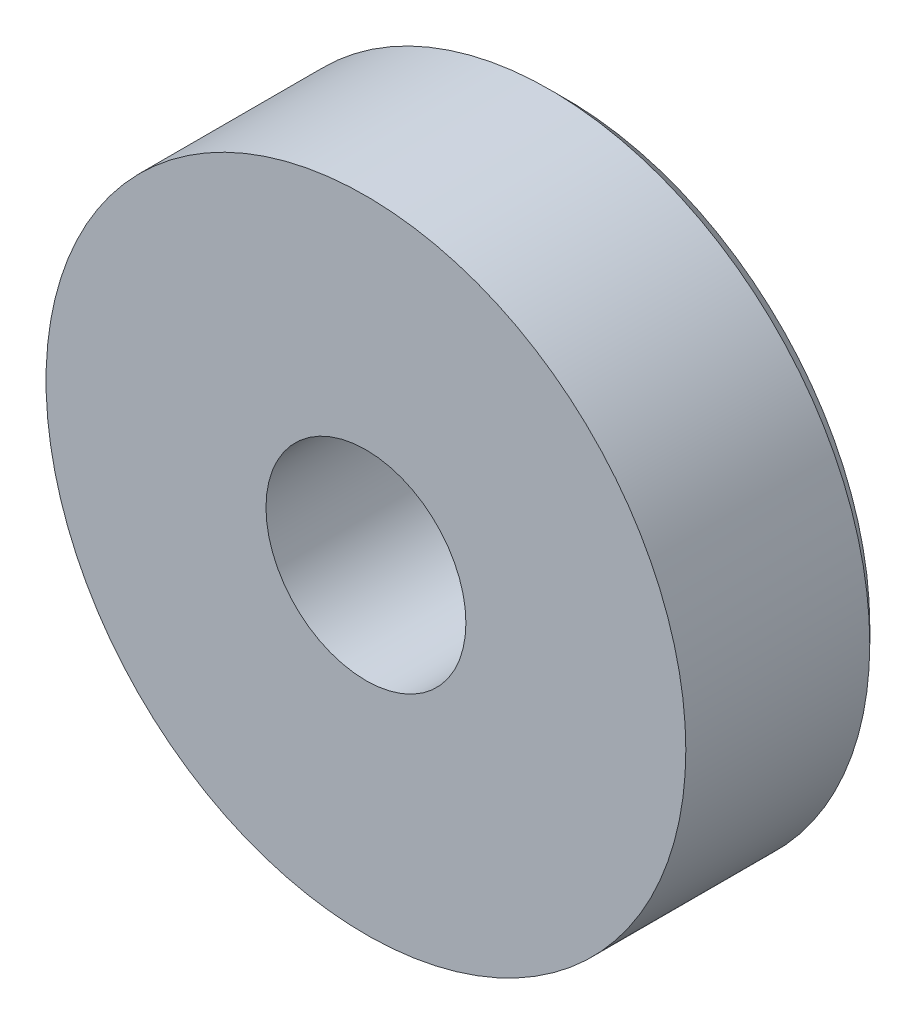
ISO-10303-21;
HEADER;
FILE_DESCRIPTION(('STEP AP214'),'2;1');
FILE_NAME('part.step','',(''),(''),'','','');
FILE_SCHEMA(('AUTOMOTIVE_DESIGN { 1 0 10303 214 1 1 1 1 }'));
ENDSEC;
DATA;
#1=APPLICATION_CONTEXT('core data for automotive mechanical design processes');
#2=APPLICATION_PROTOCOL_DEFINITION('international standard','automotive_design',2000,#1);
#3=PRODUCT_CONTEXT('',#1,'mechanical');
#4=PRODUCT('Part','Part','',(#3));
#5=PRODUCT_RELATED_PRODUCT_CATEGORY('part','',(#4));
#6=PRODUCT_DEFINITION_FORMATION('','',#4);
#7=PRODUCT_DEFINITION_CONTEXT('part definition',#1,'design');
#8=PRODUCT_DEFINITION('design','',#6,#7);
#9=PRODUCT_DEFINITION_SHAPE('','',#8);
#10=(LENGTH_UNIT() NAMED_UNIT(*) SI_UNIT(.MILLI.,.METRE.));
#11=(NAMED_UNIT(*) PLANE_ANGLE_UNIT() SI_UNIT($,.RADIAN.));
#12=(NAMED_UNIT(*) SI_UNIT($,.STERADIAN.) SOLID_ANGLE_UNIT());
#13=UNCERTAINTY_MEASURE_WITH_UNIT(LENGTH_MEASURE(1.E-05),#10,'distance_accuracy_value','');
#14=(GEOMETRIC_REPRESENTATION_CONTEXT(3) GLOBAL_UNCERTAINTY_ASSIGNED_CONTEXT((#13)) GLOBAL_UNIT_ASSIGNED_CONTEXT((#10,
#11,#12)) REPRESENTATION_CONTEXT('',''));
#15=CARTESIAN_POINT('',(0.,0.,0.));
#16=DIRECTION('',(0.,0.,1.));
#17=DIRECTION('',(1.,0.,0.));
#18=AXIS2_PLACEMENT_3D('',#15,#16,#17);
#19=CARTESIAN_POINT('',(0.,0.,-2.2));
#20=DIRECTION('',(0.,0.,-1.));
#21=DIRECTION('',(1.,0.,0.));
#22=AXIS2_PLACEMENT_3D('',#19,#20,#21);
#23=CYLINDRICAL_SURFACE('',#22,6.5);
#24=DIRECTION('',(0.,0.,-1.));
#25=VECTOR('',#24,1.);
#26=CARTESIAN_POINT('',(6.5,0.,-2.2));
#27=LINE('',#26,#25);
#28=CARTESIAN_POINT('',(6.5,0.,-2.2));
#29=VERTEX_POINT('',#28);
#30=CARTESIAN_POINT('',(6.5,0.,-2.45));
#31=VERTEX_POINT('',#30);
#32=EDGE_CURVE('E11',#29,#31,#27,.T.);
#33=ORIENTED_EDGE('',*,*,#32,.T.);
#34=CARTESIAN_POINT('',(0.,0.,-2.45));
#35=DIRECTION('',(0.,0.,-1.));
#36=DIRECTION('',(1.,0.,0.));
#37=AXIS2_PLACEMENT_3D('',#34,#35,#36);
#38=CIRCLE('',#37,6.5);
#39=EDGE_CURVE('E25',#31,#31,#38,.T.);
#40=ORIENTED_EDGE('',*,*,#39,.T.);
#41=ORIENTED_EDGE('',*,*,#32,.F.);
#42=CARTESIAN_POINT('',(0.,0.,-2.2));
#43=DIRECTION('',(0.,0.,-1.));
#44=DIRECTION('',(1.,0.,0.));
#45=AXIS2_PLACEMENT_3D('',#42,#43,#44);
#46=CIRCLE('',#45,6.5);
#47=EDGE_CURVE('E162',#29,#29,#46,.T.);
#48=ORIENTED_EDGE('',*,*,#47,.F.);
#49=EDGE_LOOP('',(#33,#40,#41,#48));
#50=FACE_BOUND('',#49,.T.);
#51=ADVANCED_FACE('F17',(#50),#23,.F.);
#52=CARTESIAN_POINT('',(0.,0.,-2.45));
#53=DIRECTION('',(0.,0.,-1.));
#54=DIRECTION('',(0.,-1.,0.));
#55=AXIS2_PLACEMENT_3D('',#52,#53,#54);
#56=PLANE('',#55);
#57=ORIENTED_EDGE('',*,*,#39,.F.);
#58=EDGE_LOOP('',(#57));
#59=FACE_BOUND('',#58,.T.);
#60=CARTESIAN_POINT('',(0.,0.,-2.45));
#61=DIRECTION('',(0.,0.,-1.));
#62=DIRECTION('',(1.,0.,0.));
#63=AXIS2_PLACEMENT_3D('',#60,#61,#62);
#64=CIRCLE('',#63,7.6);
#65=CARTESIAN_POINT('',(7.6,0.,-2.45));
#66=VERTEX_POINT('',#65);
#67=EDGE_CURVE('E156',#66,#66,#64,.T.);
#68=ORIENTED_EDGE('',*,*,#67,.T.);
#69=EDGE_LOOP('',(#68));
#70=FACE_BOUND('',#69,.T.);
#71=ADVANCED_FACE('F170',(#59,#70),#56,.T.);
#72=CARTESIAN_POINT('',(0.,0.,-2.2));
#73=DIRECTION('',(0.,0.,1.));
#74=DIRECTION('',(1.,0.,0.));
#75=AXIS2_PLACEMENT_3D('',#72,#73,#74);
#76=TOROIDAL_SURFACE('',#75,6.25,0.25);
#77=CARTESIAN_POINT('',(6.25,0.,-2.2));
#78=DIRECTION('',(0.,-1.,0.));
#79=DIRECTION('',(1.,0.,0.));
#80=AXIS2_PLACEMENT_3D('',#77,#78,#79);
#81=CIRCLE('',#80,0.25);
#82=CARTESIAN_POINT('',(6.137339055794,0.,-1.976824034335));
#83=VERTEX_POINT('',#82);
#84=EDGE_CURVE('E159',#83,#29,#81,.T.);
#85=ORIENTED_EDGE('',*,*,#84,.T.);
#86=ORIENTED_EDGE('',*,*,#47,.T.);
#87=ORIENTED_EDGE('',*,*,#84,.F.);
#88=CARTESIAN_POINT('',(0.,0.,-1.976824034335));
#89=DIRECTION('',(0.,0.,-1.));
#90=DIRECTION('',(1.,0.,0.));
#91=AXIS2_PLACEMENT_3D('',#88,#89,#90);
#92=CIRCLE('',#91,6.137339055794);
#93=EDGE_CURVE('E119',#83,#83,#92,.T.);
#94=ORIENTED_EDGE('',*,*,#93,.F.);
#95=EDGE_LOOP('',(#85,#86,#87,#94));
#96=FACE_BOUND('',#95,.T.);
#97=ADVANCED_FACE('F173',(#96),#76,.T.);
#98=CARTESIAN_POINT('',(0.,0.,-2.05));
#99=DIRECTION('',(0.,0.,1.));
#100=DIRECTION('',(1.,0.,0.));
#101=AXIS2_PLACEMENT_3D('',#98,#99,#100);
#102=CONICAL_SURFACE('',#101,8.,0.785398163397);
#103=DIRECTION('',(-0.707106781186548,0.,-0.707106781186548));
#104=VECTOR('',#103,1.);
#105=CARTESIAN_POINT('',(8.,0.,-2.05));
#106=LINE('',#105,#104);
#107=CARTESIAN_POINT('',(8.,0.,-2.05));
#108=VERTEX_POINT('',#107);
#109=EDGE_CURVE('E123',#108,#66,#106,.T.);
#110=ORIENTED_EDGE('',*,*,#109,.F.);
#111=CARTESIAN_POINT('',(0.,0.,-2.05));
#112=DIRECTION('',(0.,0.,-1.));
#113=DIRECTION('',(1.,0.,0.));
#114=AXIS2_PLACEMENT_3D('',#111,#112,#113);
#115=CIRCLE('',#114,8.);
#116=EDGE_CURVE('E131',#108,#108,#115,.T.);
#117=ORIENTED_EDGE('',*,*,#116,.T.);
#118=ORIENTED_EDGE('',*,*,#109,.T.);
#119=ORIENTED_EDGE('',*,*,#67,.F.);
#120=EDGE_LOOP('',(#110,#117,#118,#119));
#121=FACE_BOUND('',#120,.T.);
#122=ADVANCED_FACE('F177',(#121),#102,.T.);
#123=CARTESIAN_POINT('',(0.,0.,-2.45));
#124=DIRECTION('',(0.,0.,1.));
#125=DIRECTION('',(1.,0.,0.));
#126=AXIS2_PLACEMENT_3D('',#123,#124,#125);
#127=CONICAL_SURFACE('',#126,5.2,1.103309965057);
#128=DIRECTION('',(0.892703862660969,0.,0.450643776823984));
#129=VECTOR('',#128,1.);
#130=CARTESIAN_POINT('',(5.2,0.,-2.45));
#131=LINE('',#130,#129);
#132=CARTESIAN_POINT('',(5.2,0.,-2.45));
#133=VERTEX_POINT('',#132);
#134=EDGE_CURVE('E124',#133,#83,#131,.T.);
#135=ORIENTED_EDGE('',*,*,#134,.T.);
#136=ORIENTED_EDGE('',*,*,#93,.T.);
#137=ORIENTED_EDGE('',*,*,#134,.F.);
#138=CARTESIAN_POINT('',(0.,0.,-2.45));
#139=DIRECTION('',(0.,0.,-1.));
#140=DIRECTION('',(1.,0.,0.));
#141=AXIS2_PLACEMENT_3D('',#138,#139,#140);
#142=CIRCLE('',#141,5.2);
#143=EDGE_CURVE('E143',#133,#133,#142,.T.);
#144=ORIENTED_EDGE('',*,*,#143,.F.);
#145=EDGE_LOOP('',(#135,#136,#137,#144));
#146=FACE_BOUND('',#145,.T.);
#147=ADVANCED_FACE('F237',(#146),#127,.T.);
#148=CARTESIAN_POINT('',(0.,0.,2.55));
#149=DIRECTION('',(0.,0.,-1.));
#150=DIRECTION('',(1.,0.,0.));
#151=AXIS2_PLACEMENT_3D('',#148,#149,#150);
#152=CYLINDRICAL_SURFACE('',#151,8.);
#153=DIRECTION('',(0.,0.,-1.));
#154=VECTOR('',#153,1.);
#155=CARTESIAN_POINT('',(8.,0.,2.55));
#156=LINE('',#155,#154);
#157=CARTESIAN_POINT('',(8.,0.,2.55));
#158=VERTEX_POINT('',#157);
#159=EDGE_CURVE('E139',#158,#108,#156,.T.);
#160=ORIENTED_EDGE('',*,*,#159,.F.);
#161=CARTESIAN_POINT('',(0.,0.,2.55));
#162=DIRECTION('',(0.,0.,-1.));
#163=DIRECTION('',(1.,0.,0.));
#164=AXIS2_PLACEMENT_3D('',#161,#162,#163);
#165=CIRCLE('',#164,8.);
#166=EDGE_CURVE('E138',#158,#158,#165,.T.);
#167=ORIENTED_EDGE('',*,*,#166,.T.);
#168=ORIENTED_EDGE('',*,*,#159,.T.);
#169=ORIENTED_EDGE('',*,*,#116,.F.);
#170=EDGE_LOOP('',(#160,#167,#168,#169));
#171=FACE_BOUND('',#170,.T.);
#172=ADVANCED_FACE('F180',(#171),#152,.T.);
#173=CARTESIAN_POINT('',(0.,0.,-2.45));
#174=DIRECTION('',(0.,0.,-1.));
#175=DIRECTION('',(0.,-1.,0.));
#176=AXIS2_PLACEMENT_3D('',#173,#174,#175);
#177=PLANE('',#176);
#178=CARTESIAN_POINT('',(0.,0.,-2.45));
#179=DIRECTION('',(0.,0.,-1.));
#180=DIRECTION('',(1.,0.,0.));
#181=AXIS2_PLACEMENT_3D('',#178,#179,#180);
#182=CIRCLE('',#181,4.2);
#183=CARTESIAN_POINT('',(4.2,0.,-2.45));
#184=VERTEX_POINT('',#183);
#185=EDGE_CURVE('E127',#184,#184,#182,.T.);
#186=ORIENTED_EDGE('',*,*,#185,.F.);
#187=EDGE_LOOP('',(#186));
#188=FACE_BOUND('',#187,.T.);
#189=ORIENTED_EDGE('',*,*,#143,.T.);
#190=EDGE_LOOP('',(#189));
#191=FACE_BOUND('',#190,.T.);
#192=ADVANCED_FACE('F187',(#188,#191),#177,.T.);
#193=CARTESIAN_POINT('',(0.,0.,2.55));
#194=DIRECTION('',(0.,0.,-1.));
#195=DIRECTION('',(0.,-1.,0.));
#196=AXIS2_PLACEMENT_3D('',#193,#194,#195);
#197=PLANE('',#196);
#198=ORIENTED_EDGE('',*,*,#166,.F.);
#199=EDGE_LOOP('',(#198));
#200=FACE_BOUND('',#199,.T.);
#201=CARTESIAN_POINT('',(0.,0.,2.55));
#202=DIRECTION('',(0.,0.,-1.));
#203=DIRECTION('',(1.,0.,0.));
#204=AXIS2_PLACEMENT_3D('',#201,#202,#203);
#205=CIRCLE('',#204,2.5);
#206=CARTESIAN_POINT('',(2.5,0.,2.55));
#207=VERTEX_POINT('',#206);
#208=EDGE_CURVE('E116',#207,#207,#205,.T.);
#209=ORIENTED_EDGE('',*,*,#208,.T.);
#210=EDGE_LOOP('',(#209));
#211=FACE_BOUND('',#210,.T.);
#212=ADVANCED_FACE('F183',(#200,#211),#197,.F.);
#213=CARTESIAN_POINT('',(0.,0.,-2.45));
#214=DIRECTION('',(0.,0.,-1.));
#215=DIRECTION('',(1.,0.,0.));
#216=AXIS2_PLACEMENT_3D('',#213,#214,#215);
#217=CONICAL_SURFACE('',#216,4.2,0.19739555985);
#218=ORIENTED_EDGE('',*,*,#185,.T.);
#219=DIRECTION('',(-0.196116135137992,0.,0.980580675690959));
#220=VECTOR('',#219,1.);
#221=CARTESIAN_POINT('',(4.2,0.,-2.45));
#222=LINE('',#221,#220);
#223=CARTESIAN_POINT('',(4.1,0.,-1.95));
#224=VERTEX_POINT('',#223);
#225=EDGE_CURVE('E135',#184,#224,#222,.T.);
#226=ORIENTED_EDGE('',*,*,#225,.T.);
#227=CARTESIAN_POINT('',(0.,0.,-1.95));
#228=DIRECTION('',(0.,0.,-1.));
#229=DIRECTION('',(1.,0.,0.));
#230=AXIS2_PLACEMENT_3D('',#227,#228,#229);
#231=CIRCLE('',#230,4.1);
#232=EDGE_CURVE('E101',#224,#224,#231,.T.);
#233=ORIENTED_EDGE('',*,*,#232,.F.);
#234=ORIENTED_EDGE('',*,*,#225,.F.);
#235=EDGE_LOOP('',(#218,#226,#233,#234));
#236=FACE_BOUND('',#235,.T.);
#237=ADVANCED_FACE('F186',(#236),#217,.F.);
#238=CARTESIAN_POINT('',(0.,0.,-2.5));
#239=DIRECTION('',(0.,0.,1.));
#240=DIRECTION('',(1.,0.,0.));
#241=AXIS2_PLACEMENT_3D('',#238,#239,#240);
#242=CYLINDRICAL_SURFACE('',#241,2.5);
#243=DIRECTION('',(0.,0.,1.));
#244=VECTOR('',#243,1.);
#245=CARTESIAN_POINT('',(2.5,0.,-2.5));
#246=LINE('',#245,#244);
#247=CARTESIAN_POINT('',(2.5,0.,-2.1));
#248=VERTEX_POINT('',#247);
#249=EDGE_CURVE('E112',#248,#207,#246,.T.);
#250=ORIENTED_EDGE('',*,*,#249,.F.);
#251=CARTESIAN_POINT('',(0.,0.,-2.1));
#252=DIRECTION('',(0.,0.,-1.));
#253=DIRECTION('',(1.,0.,0.));
#254=AXIS2_PLACEMENT_3D('',#251,#252,#253);
#255=CIRCLE('',#254,2.5);
#256=EDGE_CURVE('E93',#248,#248,#255,.T.);
#257=ORIENTED_EDGE('',*,*,#256,.T.);
#258=ORIENTED_EDGE('',*,*,#249,.T.);
#259=ORIENTED_EDGE('',*,*,#208,.F.);
#260=EDGE_LOOP('',(#250,#257,#258,#259));
#261=FACE_BOUND('',#260,.T.);
#262=ADVANCED_FACE('F191',(#261),#242,.F.);
#263=CARTESIAN_POINT('',(0.,0.,-1.95));
#264=DIRECTION('',(0.,0.,1.));
#265=DIRECTION('',(1.,0.,0.));
#266=AXIS2_PLACEMENT_3D('',#263,#264,#265);
#267=CONICAL_SURFACE('',#266,4.1,0.179853499792);
#268=ORIENTED_EDGE('',*,*,#232,.T.);
#269=DIRECTION('',(-0.178885438199983,0.,-0.983869910099907));
#270=VECTOR('',#269,1.);
#271=CARTESIAN_POINT('',(4.1,0.,-1.95));
#272=LINE('',#271,#270);
#273=CARTESIAN_POINT('',(4.,0.,-2.5));
#274=VERTEX_POINT('',#273);
#275=EDGE_CURVE('E111',#224,#274,#272,.T.);
#276=ORIENTED_EDGE('',*,*,#275,.T.);
#277=CARTESIAN_POINT('',(0.,0.,-2.5));
#278=DIRECTION('',(0.,0.,-1.));
#279=DIRECTION('',(1.,0.,0.));
#280=AXIS2_PLACEMENT_3D('',#277,#278,#279);
#281=CIRCLE('',#280,4.);
#282=EDGE_CURVE('E95',#274,#274,#281,.T.);
#283=ORIENTED_EDGE('',*,*,#282,.F.);
#284=ORIENTED_EDGE('',*,*,#275,.F.);
#285=EDGE_LOOP('',(#268,#276,#283,#284));
#286=FACE_BOUND('',#285,.T.);
#287=ADVANCED_FACE('F193',(#286),#267,.T.);
#288=CARTESIAN_POINT('',(0.,0.,-2.1));
#289=DIRECTION('',(0.,0.,-1.));
#290=DIRECTION('',(1.,0.,0.));
#291=AXIS2_PLACEMENT_3D('',#288,#289,#290);
#292=CONICAL_SURFACE('',#291,2.5,0.785398163397);
#293=DIRECTION('',(-0.707106781186548,0.,0.707106781186548));
#294=VECTOR('',#293,1.);
#295=CARTESIAN_POINT('',(2.5,0.,-2.1));
#296=LINE('',#295,#294);
#297=CARTESIAN_POINT('',(2.9,0.,-2.5));
#298=VERTEX_POINT('',#297);
#299=EDGE_CURVE('E88',#298,#248,#296,.T.);
#300=ORIENTED_EDGE('',*,*,#299,.F.);
#301=CARTESIAN_POINT('',(0.,0.,-2.5));
#302=DIRECTION('',(0.,0.,-1.));
#303=DIRECTION('',(1.,0.,0.));
#304=AXIS2_PLACEMENT_3D('',#301,#302,#303);
#305=CIRCLE('',#304,2.9);
#306=EDGE_CURVE('E91',#298,#298,#305,.T.);
#307=ORIENTED_EDGE('',*,*,#306,.T.);
#308=ORIENTED_EDGE('',*,*,#299,.T.);
#309=ORIENTED_EDGE('',*,*,#256,.F.);
#310=EDGE_LOOP('',(#300,#307,#308,#309));
#311=FACE_BOUND('',#310,.T.);
#312=ADVANCED_FACE('F89',(#311),#292,.F.);
#313=CARTESIAN_POINT('',(0.,0.,-2.5));
#314=DIRECTION('',(0.,0.,-1.));
#315=DIRECTION('',(0.,-1.,0.));
#316=AXIS2_PLACEMENT_3D('',#313,#314,#315);
#317=PLANE('',#316);
#318=ORIENTED_EDGE('',*,*,#282,.T.);
#319=EDGE_LOOP('',(#318));
#320=FACE_BOUND('',#319,.T.);
#321=ORIENTED_EDGE('',*,*,#306,.F.);
#322=EDGE_LOOP('',(#321));
#323=FACE_BOUND('',#322,.T.);
#324=ADVANCED_FACE('F292',(#320,#323),#317,.T.);
#325=CLOSED_SHELL('',(#51,#71,#97,#122,#147,#172,#192,#212,#237,#262,#287,#312,#324));
#326=MANIFOLD_SOLID_BREP('B1',#325);
#327=ADVANCED_BREP_SHAPE_REPRESENTATION('',(#18,#326),#14);
#328=SHAPE_DEFINITION_REPRESENTATION(#9,#327);
ENDSEC;
END-ISO-10303-21;
